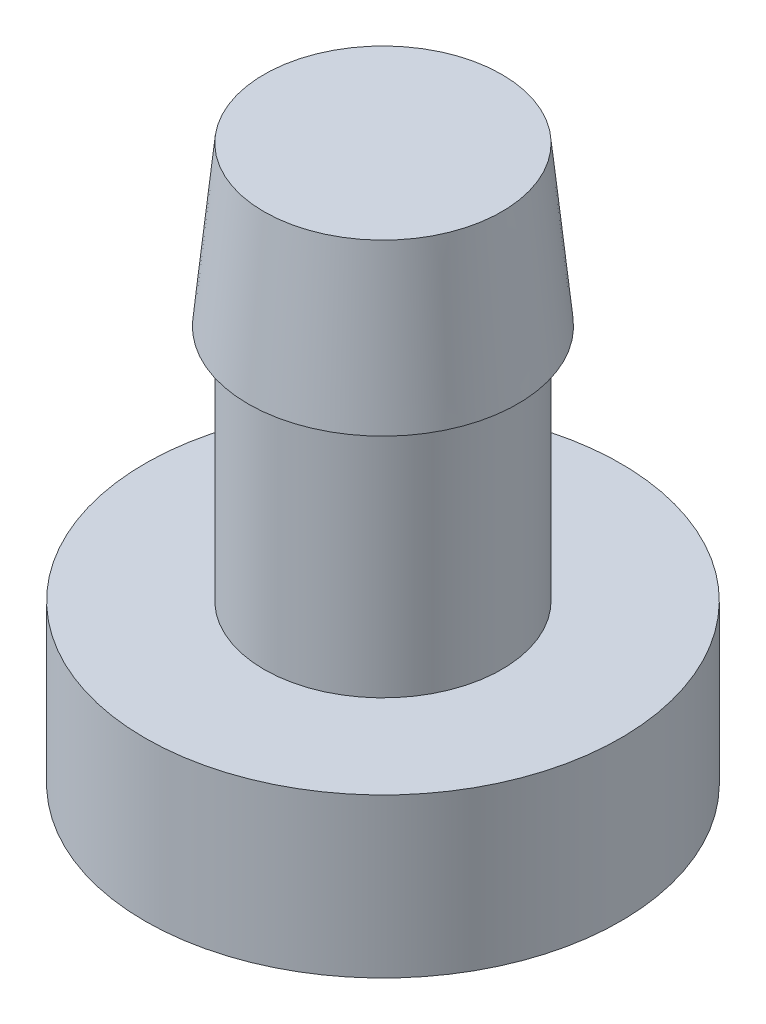
ISO-10303-21;
HEADER;
FILE_DESCRIPTION(('STEP AP214'),'2;1');
FILE_NAME('part.step','',(''),(''),'','','');
FILE_SCHEMA(('AUTOMOTIVE_DESIGN { 1 0 10303 214 1 1 1 1 }'));
ENDSEC;
DATA;
#1=APPLICATION_CONTEXT('core data for automotive mechanical design processes');
#2=APPLICATION_PROTOCOL_DEFINITION('international standard','automotive_design',2000,#1);
#3=PRODUCT_CONTEXT('',#1,'mechanical');
#4=PRODUCT('Part','Part','',(#3));
#5=PRODUCT_RELATED_PRODUCT_CATEGORY('part','',(#4));
#6=PRODUCT_DEFINITION_FORMATION('','',#4);
#7=PRODUCT_DEFINITION_CONTEXT('part definition',#1,'design');
#8=PRODUCT_DEFINITION('design','',#6,#7);
#9=PRODUCT_DEFINITION_SHAPE('','',#8);
#10=(LENGTH_UNIT() NAMED_UNIT(*) SI_UNIT(.MILLI.,.METRE.));
#11=(NAMED_UNIT(*) PLANE_ANGLE_UNIT() SI_UNIT($,.RADIAN.));
#12=(NAMED_UNIT(*) SI_UNIT($,.STERADIAN.) SOLID_ANGLE_UNIT());
#13=UNCERTAINTY_MEASURE_WITH_UNIT(LENGTH_MEASURE(1.E-05),#10,'distance_accuracy_value','');
#14=(GEOMETRIC_REPRESENTATION_CONTEXT(3) GLOBAL_UNCERTAINTY_ASSIGNED_CONTEXT((#13)) GLOBAL_UNIT_ASSIGNED_CONTEXT((#10,
#11,#12)) REPRESENTATION_CONTEXT('',''));
#15=CARTESIAN_POINT('',(0.,0.,0.));
#16=DIRECTION('',(0.,0.,1.));
#17=DIRECTION('',(1.,0.,0.));
#18=AXIS2_PLACEMENT_3D('',#15,#16,#17);
#19=CARTESIAN_POINT('',(0.,2.,0.));
#20=DIRECTION('',(0.,-1.,0.));
#21=DIRECTION('',(0.,0.,-1.));
#22=AXIS2_PLACEMENT_3D('',#19,#20,#21);
#23=CYLINDRICAL_SURFACE('',#22,3.);
#24=CARTESIAN_POINT('',(0.,2.,0.));
#25=DIRECTION('',(0.,1.,0.));
#26=DIRECTION('',(0.,0.,1.));
#27=AXIS2_PLACEMENT_3D('',#24,#25,#26);
#28=CIRCLE('',#27,3.);
#29=CARTESIAN_POINT('',(0.,2.,3.));
#30=VERTEX_POINT('',#29);
#31=EDGE_CURVE('E38',#30,#30,#28,.T.);
#32=ORIENTED_EDGE('',*,*,#31,.F.);
#33=EDGE_LOOP('',(#32));
#34=FACE_BOUND('',#33,.T.);
#35=CARTESIAN_POINT('',(0.,0.,0.));
#36=DIRECTION('',(0.,1.,0.));
#37=DIRECTION('',(0.,0.,1.));
#38=AXIS2_PLACEMENT_3D('',#35,#36,#37);
#39=CIRCLE('',#38,3.);
#40=CARTESIAN_POINT('',(0.,0.,3.));
#41=VERTEX_POINT('',#40);
#42=EDGE_CURVE('E34',#41,#41,#39,.T.);
#43=ORIENTED_EDGE('',*,*,#42,.T.);
#44=EDGE_LOOP('',(#43));
#45=FACE_BOUND('',#44,.T.);
#46=ADVANCED_FACE('F31',(#34,#45),#23,.T.);
#47=CARTESIAN_POINT('',(0.,2.,0.));
#48=DIRECTION('',(0.,1.,0.));
#49=DIRECTION('',(0.,0.,1.));
#50=AXIS2_PLACEMENT_3D('',#47,#48,#49);
#51=PLANE('',#50);
#52=CARTESIAN_POINT('',(0.,2.,0.));
#53=DIRECTION('',(0.,1.,0.));
#54=DIRECTION('',(0.,0.,1.));
#55=AXIS2_PLACEMENT_3D('',#52,#53,#54);
#56=CIRCLE('',#55,1.5);
#57=CARTESIAN_POINT('',(0.,2.,1.5));
#58=VERTEX_POINT('',#57);
#59=EDGE_CURVE('E10',#58,#58,#56,.T.);
#60=ORIENTED_EDGE('',*,*,#59,.F.);
#61=EDGE_LOOP('',(#60));
#62=FACE_BOUND('',#61,.T.);
#63=ORIENTED_EDGE('',*,*,#31,.T.);
#64=EDGE_LOOP('',(#63));
#65=FACE_BOUND('',#64,.T.);
#66=ADVANCED_FACE('F69',(#62,#65),#51,.T.);
#67=CARTESIAN_POINT('',(0.,0.,0.));
#68=DIRECTION('',(0.,1.,0.));
#69=DIRECTION('',(0.,0.,1.));
#70=AXIS2_PLACEMENT_3D('',#67,#68,#69);
#71=PLANE('',#70);
#72=ORIENTED_EDGE('',*,*,#42,.F.);
#73=EDGE_LOOP('',(#72));
#74=FACE_BOUND('',#73,.T.);
#75=ADVANCED_FACE('F74',(#74),#71,.F.);
#76=CARTESIAN_POINT('',(0.,7.,0.));
#77=DIRECTION('',(0.,-1.,0.));
#78=DIRECTION('',(0.,0.,-1.));
#79=AXIS2_PLACEMENT_3D('',#76,#77,#78);
#80=CYLINDRICAL_SURFACE('',#79,1.5);
#81=CARTESIAN_POINT('',(0.,5.,0.));
#82=DIRECTION('',(0.,-1.,0.));
#83=DIRECTION('',(0.,0.,-1.));
#84=AXIS2_PLACEMENT_3D('',#81,#82,#83);
#85=CIRCLE('',#84,1.5);
#86=CARTESIAN_POINT('',(0.,5.,-1.5));
#87=VERTEX_POINT('',#86);
#88=EDGE_CURVE('E47',#87,#87,#85,.T.);
#89=ORIENTED_EDGE('',*,*,#88,.T.);
#90=EDGE_LOOP('',(#89));
#91=FACE_BOUND('',#90,.T.);
#92=ORIENTED_EDGE('',*,*,#59,.T.);
#93=EDGE_LOOP('',(#92));
#94=FACE_BOUND('',#93,.T.);
#95=ADVANCED_FACE('F83',(#91,#94),#80,.T.);
#96=CARTESIAN_POINT('',(0.,5.,0.));
#97=DIRECTION('',(0.,-1.,0.));
#98=DIRECTION('',(0.,0.,-1.));
#99=AXIS2_PLACEMENT_3D('',#96,#97,#98);
#100=CONICAL_SURFACE('',#99,1.7,0.0996686524911623);
#101=CARTESIAN_POINT('',(0.,7.,0.));
#102=DIRECTION('',(0.,-1.,0.));
#103=DIRECTION('',(0.,0.,-1.));
#104=AXIS2_PLACEMENT_3D('',#101,#102,#103);
#105=CIRCLE('',#104,1.5);
#106=CARTESIAN_POINT('',(0.,7.,-1.5));
#107=VERTEX_POINT('',#106);
#108=EDGE_CURVE('E50',#107,#107,#105,.T.);
#109=ORIENTED_EDGE('',*,*,#108,.T.);
#110=EDGE_LOOP('',(#109));
#111=FACE_BOUND('',#110,.T.);
#112=CARTESIAN_POINT('',(0.,5.,0.));
#113=DIRECTION('',(0.,-1.,0.));
#114=DIRECTION('',(0.,0.,-1.));
#115=AXIS2_PLACEMENT_3D('',#112,#113,#114);
#116=CIRCLE('',#115,1.7);
#117=CARTESIAN_POINT('',(0.,5.,-1.7));
#118=VERTEX_POINT('',#117);
#119=EDGE_CURVE('E44',#118,#118,#116,.T.);
#120=ORIENTED_EDGE('',*,*,#119,.F.);
#121=EDGE_LOOP('',(#120));
#122=FACE_BOUND('',#121,.T.);
#123=ADVANCED_FACE('F54',(#111,#122),#100,.T.);
#124=CARTESIAN_POINT('',(1.5,5.,0.));
#125=DIRECTION('',(0.,-1.,0.));
#126=DIRECTION('',(0.,0.,-1.));
#127=AXIS2_PLACEMENT_3D('',#124,#125,#126);
#128=PLANE('',#127);
#129=ORIENTED_EDGE('',*,*,#119,.T.);
#130=EDGE_LOOP('',(#129));
#131=FACE_BOUND('',#130,.T.);
#132=ORIENTED_EDGE('',*,*,#88,.F.);
#133=EDGE_LOOP('',(#132));
#134=FACE_BOUND('',#133,.T.);
#135=ADVANCED_FACE('F59',(#131,#134),#128,.T.);
#136=CARTESIAN_POINT('',(0.,7.,0.));
#137=DIRECTION('',(0.,1.,0.));
#138=DIRECTION('',(0.,0.,1.));
#139=AXIS2_PLACEMENT_3D('',#136,#137,#138);
#140=PLANE('',#139);
#141=ORIENTED_EDGE('',*,*,#108,.F.);
#142=EDGE_LOOP('',(#141));
#143=FACE_BOUND('',#142,.T.);
#144=ADVANCED_FACE('F57',(#143),#140,.T.);
#145=CLOSED_SHELL('',(#46,#66,#75,#95,#123,#135,#144));
#146=MANIFOLD_SOLID_BREP('B2',#145);
#147=ADVANCED_BREP_SHAPE_REPRESENTATION('',(#18,#146),#14);
#148=SHAPE_DEFINITION_REPRESENTATION(#9,#147);
ENDSEC;
END-ISO-10303-21;
